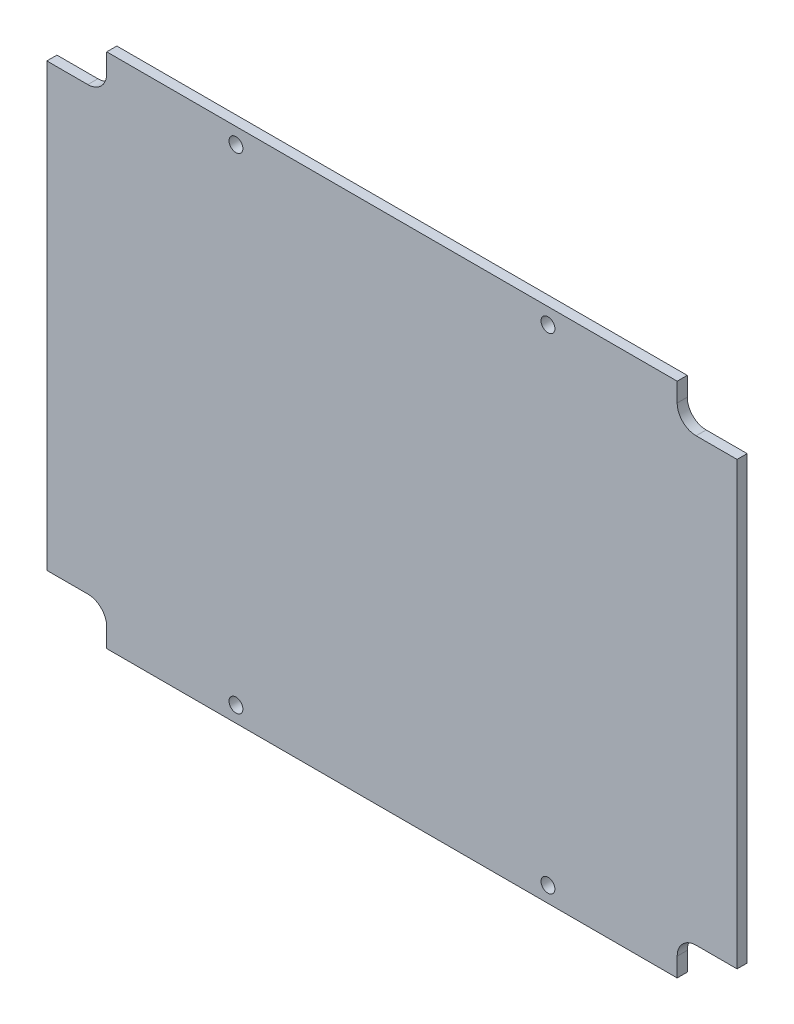
ISO-10303-21;
HEADER;
FILE_DESCRIPTION(('STEP AP214'),'2;1');
FILE_NAME('part.step','',(''),(''),'','','');
FILE_SCHEMA(('AUTOMOTIVE_DESIGN { 1 0 10303 214 1 1 1 1 }'));
ENDSEC;
DATA;
#1=APPLICATION_CONTEXT('core data for automotive mechanical design processes');
#2=APPLICATION_PROTOCOL_DEFINITION('international standard','automotive_design',2000,#1);
#3=PRODUCT_CONTEXT('',#1,'mechanical');
#4=PRODUCT('Part','Part','',(#3));
#5=PRODUCT_RELATED_PRODUCT_CATEGORY('part','',(#4));
#6=PRODUCT_DEFINITION_FORMATION('','',#4);
#7=PRODUCT_DEFINITION_CONTEXT('part definition',#1,'design');
#8=PRODUCT_DEFINITION('design','',#6,#7);
#9=PRODUCT_DEFINITION_SHAPE('','',#8);
#10=(LENGTH_UNIT() NAMED_UNIT(*) SI_UNIT(.MILLI.,.METRE.));
#11=(NAMED_UNIT(*) PLANE_ANGLE_UNIT() SI_UNIT($,.RADIAN.));
#12=(NAMED_UNIT(*) SI_UNIT($,.STERADIAN.) SOLID_ANGLE_UNIT());
#13=UNCERTAINTY_MEASURE_WITH_UNIT(LENGTH_MEASURE(1.E-05),#10,'distance_accuracy_value','');
#14=(GEOMETRIC_REPRESENTATION_CONTEXT(3) GLOBAL_UNCERTAINTY_ASSIGNED_CONTEXT((#13)) GLOBAL_UNIT_ASSIGNED_CONTEXT((#10,
#11,#12)) REPRESENTATION_CONTEXT('',''));
#15=CARTESIAN_POINT('',(0.,0.,0.));
#16=DIRECTION('',(0.,0.,1.));
#17=DIRECTION('',(1.,0.,0.));
#18=AXIS2_PLACEMENT_3D('',#15,#16,#17);
#19=CARTESIAN_POINT('',(54.006358498144,9.95185693007489,1.6));
#20=DIRECTION('',(0.,0.,-1.));
#21=DIRECTION('',(-1.,0.,0.));
#22=AXIS2_PLACEMENT_3D('',#19,#20,#21);
#23=PLANE('',#22);
#24=CARTESIAN_POINT('',(24.006358498144,6.45185693007488,1.6));
#25=DIRECTION('',(0.,0.,1.));
#26=DIRECTION('',(1.,0.,0.));
#27=AXIS2_PLACEMENT_3D('',#24,#25,#26);
#28=CIRCLE('',#27,1.1);
#29=CARTESIAN_POINT('',(25.106358498144,6.45185693007488,1.6));
#30=VERTEX_POINT('',#29);
#31=EDGE_CURVE('E321',#30,#30,#28,.T.);
#32=ORIENTED_EDGE('',*,*,#31,.F.);
#33=EDGE_LOOP('',(#32));
#34=FACE_BOUND('',#33,.T.);
#35=CARTESIAN_POINT('',(-25.493641501856,83.4518569300749,1.6));
#36=DIRECTION('',(0.,0.,1.));
#37=DIRECTION('',(1.,0.,0.));
#38=AXIS2_PLACEMENT_3D('',#35,#36,#37);
#39=CIRCLE('',#38,1.1);
#40=CARTESIAN_POINT('',(-24.393641501856,83.4518569300749,1.6));
#41=VERTEX_POINT('',#40);
#42=EDGE_CURVE('E298',#41,#41,#39,.T.);
#43=ORIENTED_EDGE('',*,*,#42,.F.);
#44=EDGE_LOOP('',(#43));
#45=FACE_BOUND('',#44,.T.);
#46=DIRECTION('',(0.,1.,0.));
#47=VECTOR('',#46,1.);
#48=CARTESIAN_POINT('',(54.006358498144,79.9518569300749,1.6));
#49=LINE('',#48,#47);
#50=CARTESIAN_POINT('',(54.006358498144,9.95185693007489,1.6));
#51=VERTEX_POINT('',#50);
#52=CARTESIAN_POINT('',(54.006358498144,79.9518569300749,1.6));
#53=VERTEX_POINT('',#52);
#54=EDGE_CURVE('E152',#51,#53,#49,.T.);
#55=ORIENTED_EDGE('',*,*,#54,.T.);
#56=DIRECTION('',(-1.,0.,0.));
#57=VECTOR('',#56,1.);
#58=CARTESIAN_POINT('',(54.006358498144,79.9518569300749,1.6));
#59=LINE('',#58,#57);
#60=CARTESIAN_POINT('',(47.506358498144,79.9518569300749,1.6));
#61=VERTEX_POINT('',#60);
#62=EDGE_CURVE('E143',#53,#61,#59,.T.);
#63=ORIENTED_EDGE('',*,*,#62,.T.);
#64=CARTESIAN_POINT('',(47.506358498144,82.9518569300749,1.6));
#65=DIRECTION('',(0.,0.,-1.));
#66=DIRECTION('',(-1.,0.,0.));
#67=AXIS2_PLACEMENT_3D('',#64,#65,#66);
#68=CIRCLE('',#67,3.);
#69=CARTESIAN_POINT('',(44.506358498144,82.9518569300749,1.6));
#70=VERTEX_POINT('',#69);
#71=EDGE_CURVE('E11',#61,#70,#68,.T.);
#72=ORIENTED_EDGE('',*,*,#71,.T.);
#73=DIRECTION('',(0.,1.,0.));
#74=VECTOR('',#73,1.);
#75=CARTESIAN_POINT('',(44.506358498144,79.9518569300749,1.6));
#76=LINE('',#75,#74);
#77=CARTESIAN_POINT('',(44.506358498144,85.9518569300749,1.6));
#78=VERTEX_POINT('',#77);
#79=EDGE_CURVE('E151',#70,#78,#76,.T.);
#80=ORIENTED_EDGE('',*,*,#79,.T.);
#81=DIRECTION('',(-1.,0.,0.));
#82=VECTOR('',#81,1.);
#83=CARTESIAN_POINT('',(-45.993641501856,85.9518569300749,1.6));
#84=LINE('',#83,#82);
#85=CARTESIAN_POINT('',(-45.993641501856,85.9518569300749,1.6));
#86=VERTEX_POINT('',#85);
#87=EDGE_CURVE('E307',#78,#86,#84,.T.);
#88=ORIENTED_EDGE('',*,*,#87,.T.);
#89=DIRECTION('',(0.,-1.,0.));
#90=VECTOR('',#89,1.);
#91=CARTESIAN_POINT('',(-45.993641501856,85.9518569300749,1.6));
#92=LINE('',#91,#90);
#93=CARTESIAN_POINT('',(-45.993641501856,82.9518569300749,1.6));
#94=VERTEX_POINT('',#93);
#95=EDGE_CURVE('E209',#86,#94,#92,.T.);
#96=ORIENTED_EDGE('',*,*,#95,.T.);
#97=CARTESIAN_POINT('',(-48.993641501856,82.9518569300749,1.6));
#98=DIRECTION('',(0.,0.,-1.));
#99=DIRECTION('',(-1.,0.,0.));
#100=AXIS2_PLACEMENT_3D('',#97,#98,#99);
#101=CIRCLE('',#100,3.);
#102=CARTESIAN_POINT('',(-48.993641501856,79.9518569300749,1.6));
#103=VERTEX_POINT('',#102);
#104=EDGE_CURVE('E202',#94,#103,#101,.T.);
#105=ORIENTED_EDGE('',*,*,#104,.T.);
#106=DIRECTION('',(-1.,0.,0.));
#107=VECTOR('',#106,1.);
#108=CARTESIAN_POINT('',(-45.993641501856,79.9518569300749,1.6));
#109=LINE('',#108,#107);
#110=CARTESIAN_POINT('',(-55.493641501856,79.9518569300749,1.6));
#111=VERTEX_POINT('',#110);
#112=EDGE_CURVE('E206',#103,#111,#109,.T.);
#113=ORIENTED_EDGE('',*,*,#112,.T.);
#114=DIRECTION('',(0.,-1.,0.));
#115=VECTOR('',#114,1.);
#116=CARTESIAN_POINT('',(-55.493641501856,79.9518569300749,1.6));
#117=LINE('',#116,#115);
#118=CARTESIAN_POINT('',(-55.493641501856,9.95185693007487,1.6));
#119=VERTEX_POINT('',#118);
#120=EDGE_CURVE('E219',#111,#119,#117,.T.);
#121=ORIENTED_EDGE('',*,*,#120,.T.);
#122=DIRECTION('',(1.,0.,0.));
#123=VECTOR('',#122,1.);
#124=CARTESIAN_POINT('',(-45.993641501856,9.95185693007488,1.6));
#125=LINE('',#124,#123);
#126=CARTESIAN_POINT('',(-48.993641501856,9.95185693007488,1.6));
#127=VERTEX_POINT('',#126);
#128=EDGE_CURVE('E282',#119,#127,#125,.T.);
#129=ORIENTED_EDGE('',*,*,#128,.T.);
#130=CARTESIAN_POINT('',(-48.993641501856,6.95185693007488,1.6));
#131=DIRECTION('',(0.,0.,-1.));
#132=DIRECTION('',(-1.,0.,0.));
#133=AXIS2_PLACEMENT_3D('',#130,#131,#132);
#134=CIRCLE('',#133,3.);
#135=CARTESIAN_POINT('',(-45.993641501856,6.95185693007488,1.6));
#136=VERTEX_POINT('',#135);
#137=EDGE_CURVE('E198',#127,#136,#134,.T.);
#138=ORIENTED_EDGE('',*,*,#137,.T.);
#139=DIRECTION('',(0.,-1.,0.));
#140=VECTOR('',#139,1.);
#141=CARTESIAN_POINT('',(-45.993641501856,3.95185693007488,1.6));
#142=LINE('',#141,#140);
#143=CARTESIAN_POINT('',(-45.993641501856,3.95185693007488,1.6));
#144=VERTEX_POINT('',#143);
#145=EDGE_CURVE('E280',#136,#144,#142,.T.);
#146=ORIENTED_EDGE('',*,*,#145,.T.);
#147=DIRECTION('',(1.,0.,0.));
#148=VECTOR('',#147,1.);
#149=CARTESIAN_POINT('',(-45.993641501856,3.95185693007488,1.6));
#150=LINE('',#149,#148);
#151=CARTESIAN_POINT('',(44.506358498144,3.95185693007488,1.6));
#152=VERTEX_POINT('',#151);
#153=EDGE_CURVE('E286',#144,#152,#150,.T.);
#154=ORIENTED_EDGE('',*,*,#153,.T.);
#155=DIRECTION('',(0.,1.,0.));
#156=VECTOR('',#155,1.);
#157=CARTESIAN_POINT('',(44.506358498144,9.95185693007489,1.6));
#158=LINE('',#157,#156);
#159=CARTESIAN_POINT('',(44.506358498144,6.95185693007489,1.6));
#160=VERTEX_POINT('',#159);
#161=EDGE_CURVE('E288',#152,#160,#158,.T.);
#162=ORIENTED_EDGE('',*,*,#161,.T.);
#163=CARTESIAN_POINT('',(47.506358498144,6.95185693007489,1.6));
#164=DIRECTION('',(0.,0.,-1.));
#165=DIRECTION('',(-1.,0.,0.));
#166=AXIS2_PLACEMENT_3D('',#163,#164,#165);
#167=CIRCLE('',#166,3.);
#168=CARTESIAN_POINT('',(47.506358498144,9.95185693007489,1.6));
#169=VERTEX_POINT('',#168);
#170=EDGE_CURVE('E194',#160,#169,#167,.T.);
#171=ORIENTED_EDGE('',*,*,#170,.T.);
#172=DIRECTION('',(1.,0.,0.));
#173=VECTOR('',#172,1.);
#174=CARTESIAN_POINT('',(54.006358498144,9.95185693007489,1.6));
#175=LINE('',#174,#173);
#176=EDGE_CURVE('E157',#169,#51,#175,.T.);
#177=ORIENTED_EDGE('',*,*,#176,.T.);
#178=EDGE_LOOP('',(#55,#63,#72,#80,#88,#96,#105,#113,#121,#129,#138,#146,#154,#162,#171,#177));
#179=FACE_BOUND('',#178,.T.);
#180=CARTESIAN_POINT('',(24.006358498144,83.4518569300749,1.6));
#181=DIRECTION('',(0.,0.,1.));
#182=DIRECTION('',(1.,0.,0.));
#183=AXIS2_PLACEMENT_3D('',#180,#181,#182);
#184=CIRCLE('',#183,1.1);
#185=CARTESIAN_POINT('',(25.106358498144,83.4518569300749,1.6));
#186=VERTEX_POINT('',#185);
#187=EDGE_CURVE('E315',#186,#186,#184,.T.);
#188=ORIENTED_EDGE('',*,*,#187,.F.);
#189=EDGE_LOOP('',(#188));
#190=FACE_BOUND('',#189,.T.);
#191=CARTESIAN_POINT('',(-25.493641501856,6.45185693007487,1.6));
#192=DIRECTION('',(0.,0.,1.));
#193=DIRECTION('',(1.,0.,0.));
#194=AXIS2_PLACEMENT_3D('',#191,#192,#193);
#195=CIRCLE('',#194,1.1);
#196=CARTESIAN_POINT('',(-24.393641501856,6.45185693007487,1.6));
#197=VERTEX_POINT('',#196);
#198=EDGE_CURVE('E327',#197,#197,#195,.T.);
#199=ORIENTED_EDGE('',*,*,#198,.F.);
#200=EDGE_LOOP('',(#199));
#201=FACE_BOUND('',#200,.T.);
#202=ADVANCED_FACE('F34',(#34,#45,#179,#190,#201),#23,.F.);
#203=CARTESIAN_POINT('',(54.006358498144,9.95185693007489,0.));
#204=DIRECTION('',(0.,0.,-1.));
#205=DIRECTION('',(-1.,0.,0.));
#206=AXIS2_PLACEMENT_3D('',#203,#204,#205);
#207=PLANE('',#206);
#208=CARTESIAN_POINT('',(24.006358498144,6.45185693007488,0.));
#209=DIRECTION('',(0.,0.,1.));
#210=DIRECTION('',(1.,0.,0.));
#211=AXIS2_PLACEMENT_3D('',#208,#209,#210);
#212=CIRCLE('',#211,1.1);
#213=CARTESIAN_POINT('',(25.106358498144,6.45185693007488,0.));
#214=VERTEX_POINT('',#213);
#215=EDGE_CURVE('E324',#214,#214,#212,.T.);
#216=ORIENTED_EDGE('',*,*,#215,.T.);
#217=EDGE_LOOP('',(#216));
#218=FACE_BOUND('',#217,.T.);
#219=CARTESIAN_POINT('',(-25.493641501856,83.4518569300749,0.));
#220=DIRECTION('',(0.,0.,1.));
#221=DIRECTION('',(1.,0.,0.));
#222=AXIS2_PLACEMENT_3D('',#219,#220,#221);
#223=CIRCLE('',#222,1.1);
#224=CARTESIAN_POINT('',(-24.393641501856,83.4518569300749,0.));
#225=VERTEX_POINT('',#224);
#226=EDGE_CURVE('E312',#225,#225,#223,.T.);
#227=ORIENTED_EDGE('',*,*,#226,.T.);
#228=EDGE_LOOP('',(#227));
#229=FACE_BOUND('',#228,.T.);
#230=DIRECTION('',(0.,1.,0.));
#231=VECTOR('',#230,1.);
#232=CARTESIAN_POINT('',(54.006358498144,79.9518569300749,0.));
#233=LINE('',#232,#231);
#234=CARTESIAN_POINT('',(54.006358498144,9.95185693007489,0.));
#235=VERTEX_POINT('',#234);
#236=CARTESIAN_POINT('',(54.006358498144,79.9518569300749,0.));
#237=VERTEX_POINT('',#236);
#238=EDGE_CURVE('E165',#235,#237,#233,.T.);
#239=ORIENTED_EDGE('',*,*,#238,.F.);
#240=DIRECTION('',(1.,0.,0.));
#241=VECTOR('',#240,1.);
#242=CARTESIAN_POINT('',(54.006358498144,9.95185693007489,0.));
#243=LINE('',#242,#241);
#244=CARTESIAN_POINT('',(47.506358498144,9.95185693007489,0.));
#245=VERTEX_POINT('',#244);
#246=EDGE_CURVE('E161',#245,#235,#243,.T.);
#247=ORIENTED_EDGE('',*,*,#246,.F.);
#248=CARTESIAN_POINT('',(47.506358498144,6.95185693007489,0.));
#249=DIRECTION('',(0.,0.,-1.));
#250=DIRECTION('',(-1.,0.,0.));
#251=AXIS2_PLACEMENT_3D('',#248,#249,#250);
#252=CIRCLE('',#251,3.);
#253=CARTESIAN_POINT('',(44.506358498144,6.95185693007489,0.));
#254=VERTEX_POINT('',#253);
#255=EDGE_CURVE('E192',#245,#254,#252,.F.);
#256=ORIENTED_EDGE('',*,*,#255,.T.);
#257=DIRECTION('',(0.,1.,0.));
#258=VECTOR('',#257,1.);
#259=CARTESIAN_POINT('',(44.506358498144,9.95185693007489,0.));
#260=LINE('',#259,#258);
#261=CARTESIAN_POINT('',(44.506358498144,3.95185693007488,0.));
#262=VERTEX_POINT('',#261);
#263=EDGE_CURVE('E250',#262,#254,#260,.T.);
#264=ORIENTED_EDGE('',*,*,#263,.F.);
#265=DIRECTION('',(1.,0.,0.));
#266=VECTOR('',#265,1.);
#267=CARTESIAN_POINT('',(-45.993641501856,3.95185693007488,0.));
#268=LINE('',#267,#266);
#269=CARTESIAN_POINT('',(-45.993641501856,3.95185693007488,0.));
#270=VERTEX_POINT('',#269);
#271=EDGE_CURVE('E248',#270,#262,#268,.T.);
#272=ORIENTED_EDGE('',*,*,#271,.F.);
#273=DIRECTION('',(0.,-1.,0.));
#274=VECTOR('',#273,1.);
#275=CARTESIAN_POINT('',(-45.993641501856,3.95185693007488,0.));
#276=LINE('',#275,#274);
#277=CARTESIAN_POINT('',(-45.993641501856,6.95185693007488,0.));
#278=VERTEX_POINT('',#277);
#279=EDGE_CURVE('E246',#278,#270,#276,.T.);
#280=ORIENTED_EDGE('',*,*,#279,.F.);
#281=CARTESIAN_POINT('',(-48.993641501856,6.95185693007488,0.));
#282=DIRECTION('',(0.,0.,-1.));
#283=DIRECTION('',(-1.,0.,0.));
#284=AXIS2_PLACEMENT_3D('',#281,#282,#283);
#285=CIRCLE('',#284,3.);
#286=CARTESIAN_POINT('',(-48.993641501856,9.95185693007488,0.));
#287=VERTEX_POINT('',#286);
#288=EDGE_CURVE('E196',#278,#287,#285,.F.);
#289=ORIENTED_EDGE('',*,*,#288,.T.);
#290=DIRECTION('',(1.,0.,0.));
#291=VECTOR('',#290,1.);
#292=CARTESIAN_POINT('',(-45.993641501856,9.95185693007488,0.));
#293=LINE('',#292,#291);
#294=CARTESIAN_POINT('',(-55.493641501856,9.95185693007487,0.));
#295=VERTEX_POINT('',#294);
#296=EDGE_CURVE('E243',#295,#287,#293,.T.);
#297=ORIENTED_EDGE('',*,*,#296,.F.);
#298=DIRECTION('',(0.,-1.,0.));
#299=VECTOR('',#298,1.);
#300=CARTESIAN_POINT('',(-55.493641501856,79.9518569300749,0.));
#301=LINE('',#300,#299);
#302=CARTESIAN_POINT('',(-55.493641501856,79.9518569300749,0.));
#303=VERTEX_POINT('',#302);
#304=EDGE_CURVE('E236',#303,#295,#301,.T.);
#305=ORIENTED_EDGE('',*,*,#304,.F.);
#306=DIRECTION('',(-1.,0.,0.));
#307=VECTOR('',#306,1.);
#308=CARTESIAN_POINT('',(-45.993641501856,79.9518569300749,0.));
#309=LINE('',#308,#307);
#310=CARTESIAN_POINT('',(-48.993641501856,79.9518569300749,0.));
#311=VERTEX_POINT('',#310);
#312=EDGE_CURVE('E229',#311,#303,#309,.T.);
#313=ORIENTED_EDGE('',*,*,#312,.F.);
#314=CARTESIAN_POINT('',(-48.993641501856,82.9518569300749,0.));
#315=DIRECTION('',(0.,0.,-1.));
#316=DIRECTION('',(-1.,0.,0.));
#317=AXIS2_PLACEMENT_3D('',#314,#315,#316);
#318=CIRCLE('',#317,3.);
#319=CARTESIAN_POINT('',(-45.993641501856,82.9518569300749,0.));
#320=VERTEX_POINT('',#319);
#321=EDGE_CURVE('E200',#311,#320,#318,.F.);
#322=ORIENTED_EDGE('',*,*,#321,.T.);
#323=DIRECTION('',(0.,-1.,0.));
#324=VECTOR('',#323,1.);
#325=CARTESIAN_POINT('',(-45.993641501856,85.9518569300749,0.));
#326=LINE('',#325,#324);
#327=CARTESIAN_POINT('',(-45.993641501856,85.9518569300749,0.));
#328=VERTEX_POINT('',#327);
#329=EDGE_CURVE('E227',#328,#320,#326,.T.);
#330=ORIENTED_EDGE('',*,*,#329,.F.);
#331=DIRECTION('',(-1.,0.,0.));
#332=VECTOR('',#331,1.);
#333=CARTESIAN_POINT('',(-45.993641501856,85.9518569300749,0.));
#334=LINE('',#333,#332);
#335=CARTESIAN_POINT('',(44.506358498144,85.9518569300749,0.));
#336=VERTEX_POINT('',#335);
#337=EDGE_CURVE('E234',#336,#328,#334,.T.);
#338=ORIENTED_EDGE('',*,*,#337,.F.);
#339=DIRECTION('',(0.,1.,0.));
#340=VECTOR('',#339,1.);
#341=CARTESIAN_POINT('',(44.506358498144,79.9518569300749,0.));
#342=LINE('',#341,#340);
#343=CARTESIAN_POINT('',(44.506358498144,82.9518569300749,0.));
#344=VERTEX_POINT('',#343);
#345=EDGE_CURVE('E238',#344,#336,#342,.T.);
#346=ORIENTED_EDGE('',*,*,#345,.F.);
#347=CARTESIAN_POINT('',(47.506358498144,82.9518569300749,0.));
#348=DIRECTION('',(0.,0.,-1.));
#349=DIRECTION('',(-1.,0.,0.));
#350=AXIS2_PLACEMENT_3D('',#347,#348,#349);
#351=CIRCLE('',#350,3.);
#352=CARTESIAN_POINT('',(47.506358498144,79.9518569300749,0.));
#353=VERTEX_POINT('',#352);
#354=EDGE_CURVE('E42',#344,#353,#351,.F.);
#355=ORIENTED_EDGE('',*,*,#354,.T.);
#356=DIRECTION('',(-1.,0.,0.));
#357=VECTOR('',#356,1.);
#358=CARTESIAN_POINT('',(54.006358498144,79.9518569300749,0.));
#359=LINE('',#358,#357);
#360=EDGE_CURVE('E297',#237,#353,#359,.T.);
#361=ORIENTED_EDGE('',*,*,#360,.F.);
#362=EDGE_LOOP('',(#239,#247,#256,#264,#272,#280,#289,#297,#305,#313,#322,#330,#338,#346,#355,#361));
#363=FACE_BOUND('',#362,.T.);
#364=CARTESIAN_POINT('',(24.006358498144,83.4518569300749,0.));
#365=DIRECTION('',(0.,0.,1.));
#366=DIRECTION('',(1.,0.,0.));
#367=AXIS2_PLACEMENT_3D('',#364,#365,#366);
#368=CIRCLE('',#367,1.1);
#369=CARTESIAN_POINT('',(25.106358498144,83.4518569300749,0.));
#370=VERTEX_POINT('',#369);
#371=EDGE_CURVE('E318',#370,#370,#368,.T.);
#372=ORIENTED_EDGE('',*,*,#371,.T.);
#373=EDGE_LOOP('',(#372));
#374=FACE_BOUND('',#373,.T.);
#375=CARTESIAN_POINT('',(-25.493641501856,6.45185693007487,0.));
#376=DIRECTION('',(0.,0.,1.));
#377=DIRECTION('',(1.,0.,0.));
#378=AXIS2_PLACEMENT_3D('',#375,#376,#377);
#379=CIRCLE('',#378,1.1);
#380=CARTESIAN_POINT('',(-24.393641501856,6.45185693007487,0.));
#381=VERTEX_POINT('',#380);
#382=EDGE_CURVE('E330',#381,#381,#379,.T.);
#383=ORIENTED_EDGE('',*,*,#382,.T.);
#384=EDGE_LOOP('',(#383));
#385=FACE_BOUND('',#384,.T.);
#386=ADVANCED_FACE('F224',(#218,#229,#363,#374,#385),#207,.T.);
#387=CARTESIAN_POINT('',(54.006358498144,79.9518569300749,1.6));
#388=DIRECTION('',(-1.,0.,0.));
#389=DIRECTION('',(0.,-1.,0.));
#390=AXIS2_PLACEMENT_3D('',#387,#388,#389);
#391=PLANE('',#390);
#392=ORIENTED_EDGE('',*,*,#238,.T.);
#393=DIRECTION('',(0.,0.,-1.));
#394=VECTOR('',#393,1.);
#395=CARTESIAN_POINT('',(54.006358498144,79.9518569300749,1.6));
#396=LINE('',#395,#394);
#397=EDGE_CURVE('E147',#53,#237,#396,.T.);
#398=ORIENTED_EDGE('',*,*,#397,.F.);
#399=ORIENTED_EDGE('',*,*,#54,.F.);
#400=DIRECTION('',(0.,0.,-1.));
#401=VECTOR('',#400,1.);
#402=CARTESIAN_POINT('',(54.006358498144,9.95185693007489,1.6));
#403=LINE('',#402,#401);
#404=EDGE_CURVE('E254',#51,#235,#403,.T.);
#405=ORIENTED_EDGE('',*,*,#404,.T.);
#406=EDGE_LOOP('',(#392,#398,#399,#405));
#407=FACE_BOUND('',#406,.T.);
#408=ADVANCED_FACE('F163',(#407),#391,.F.);
#409=CARTESIAN_POINT('',(54.006358498144,79.9518569300749,1.6));
#410=DIRECTION('',(0.,-1.,0.));
#411=DIRECTION('',(0.,0.,-1.));
#412=AXIS2_PLACEMENT_3D('',#409,#410,#411);
#413=PLANE('',#412);
#414=ORIENTED_EDGE('',*,*,#360,.T.);
#415=DIRECTION('',(0.,0.,-1.));
#416=VECTOR('',#415,1.);
#417=CARTESIAN_POINT('',(47.506358498144,79.9518569300749,1.6));
#418=LINE('',#417,#416);
#419=EDGE_CURVE('E49',#353,#61,#418,.F.);
#420=ORIENTED_EDGE('',*,*,#419,.T.);
#421=ORIENTED_EDGE('',*,*,#62,.F.);
#422=ORIENTED_EDGE('',*,*,#397,.T.);
#423=EDGE_LOOP('',(#414,#420,#421,#422));
#424=FACE_BOUND('',#423,.T.);
#425=ADVANCED_FACE('F145',(#424),#413,.F.);
#426=CARTESIAN_POINT('',(44.506358498144,79.9518569300749,1.6));
#427=DIRECTION('',(-1.,0.,0.));
#428=DIRECTION('',(0.,-1.,0.));
#429=AXIS2_PLACEMENT_3D('',#426,#427,#428);
#430=PLANE('',#429);
#431=ORIENTED_EDGE('',*,*,#79,.F.);
#432=DIRECTION('',(0.,0.,-1.));
#433=VECTOR('',#432,1.);
#434=CARTESIAN_POINT('',(44.506358498144,82.9518569300749,0.));
#435=LINE('',#434,#433);
#436=EDGE_CURVE('E188',#70,#344,#435,.T.);
#437=ORIENTED_EDGE('',*,*,#436,.T.);
#438=ORIENTED_EDGE('',*,*,#345,.T.);
#439=DIRECTION('',(0.,0.,-1.));
#440=VECTOR('',#439,1.);
#441=CARTESIAN_POINT('',(44.506358498144,85.9518569300749,1.6));
#442=LINE('',#441,#440);
#443=EDGE_CURVE('E167',#78,#336,#442,.T.);
#444=ORIENTED_EDGE('',*,*,#443,.F.);
#445=EDGE_LOOP('',(#431,#437,#438,#444));
#446=FACE_BOUND('',#445,.T.);
#447=ADVANCED_FACE('F302',(#446),#430,.F.);
#448=CARTESIAN_POINT('',(-45.993641501856,85.9518569300749,1.6));
#449=DIRECTION('',(0.,-1.,0.));
#450=DIRECTION('',(0.,0.,-1.));
#451=AXIS2_PLACEMENT_3D('',#448,#449,#450);
#452=PLANE('',#451);
#453=ORIENTED_EDGE('',*,*,#337,.T.);
#454=DIRECTION('',(0.,0.,-1.));
#455=VECTOR('',#454,1.);
#456=CARTESIAN_POINT('',(-45.993641501856,85.9518569300749,1.6));
#457=LINE('',#456,#455);
#458=EDGE_CURVE('E173',#86,#328,#457,.T.);
#459=ORIENTED_EDGE('',*,*,#458,.F.);
#460=ORIENTED_EDGE('',*,*,#87,.F.);
#461=ORIENTED_EDGE('',*,*,#443,.T.);
#462=EDGE_LOOP('',(#453,#459,#460,#461));
#463=FACE_BOUND('',#462,.T.);
#464=ADVANCED_FACE('F306',(#463),#452,.F.);
#465=CARTESIAN_POINT('',(-45.993641501856,85.9518569300749,1.6));
#466=DIRECTION('',(1.,0.,0.));
#467=DIRECTION('',(0.,1.,0.));
#468=AXIS2_PLACEMENT_3D('',#465,#466,#467);
#469=PLANE('',#468);
#470=ORIENTED_EDGE('',*,*,#329,.T.);
#471=DIRECTION('',(0.,0.,-1.));
#472=VECTOR('',#471,1.);
#473=CARTESIAN_POINT('',(-45.993641501856,82.9518569300749,1.6));
#474=LINE('',#473,#472);
#475=EDGE_CURVE('E186',#320,#94,#474,.F.);
#476=ORIENTED_EDGE('',*,*,#475,.T.);
#477=ORIENTED_EDGE('',*,*,#95,.F.);
#478=ORIENTED_EDGE('',*,*,#458,.T.);
#479=EDGE_LOOP('',(#470,#476,#477,#478));
#480=FACE_BOUND('',#479,.T.);
#481=ADVANCED_FACE('F232',(#480),#469,.F.);
#482=CARTESIAN_POINT('',(-45.993641501856,79.9518569300749,1.6));
#483=DIRECTION('',(0.,-1.,0.));
#484=DIRECTION('',(1.,0.,0.));
#485=AXIS2_PLACEMENT_3D('',#482,#483,#484);
#486=PLANE('',#485);
#487=ORIENTED_EDGE('',*,*,#112,.F.);
#488=DIRECTION('',(0.,0.,-1.));
#489=VECTOR('',#488,1.);
#490=CARTESIAN_POINT('',(-48.993641501856,79.9518569300749,0.));
#491=LINE('',#490,#489);
#492=EDGE_CURVE('E183',#103,#311,#491,.T.);
#493=ORIENTED_EDGE('',*,*,#492,.T.);
#494=ORIENTED_EDGE('',*,*,#312,.T.);
#495=DIRECTION('',(0.,0.,-1.));
#496=VECTOR('',#495,1.);
#497=CARTESIAN_POINT('',(-55.493641501856,79.9518569300749,1.6));
#498=LINE('',#497,#496);
#499=EDGE_CURVE('E217',#111,#303,#498,.T.);
#500=ORIENTED_EDGE('',*,*,#499,.F.);
#501=EDGE_LOOP('',(#487,#493,#494,#500));
#502=FACE_BOUND('',#501,.T.);
#503=ADVANCED_FACE('F214',(#502),#486,.F.);
#504=CARTESIAN_POINT('',(-55.493641501856,79.9518569300749,1.6));
#505=DIRECTION('',(1.,0.,0.));
#506=DIRECTION('',(0.,0.,-1.));
#507=AXIS2_PLACEMENT_3D('',#504,#505,#506);
#508=PLANE('',#507);
#509=ORIENTED_EDGE('',*,*,#304,.T.);
#510=DIRECTION('',(0.,0.,-1.));
#511=VECTOR('',#510,1.);
#512=CARTESIAN_POINT('',(-55.493641501856,9.95185693007487,1.6));
#513=LINE('',#512,#511);
#514=EDGE_CURVE('E262',#119,#295,#513,.T.);
#515=ORIENTED_EDGE('',*,*,#514,.F.);
#516=ORIENTED_EDGE('',*,*,#120,.F.);
#517=ORIENTED_EDGE('',*,*,#499,.T.);
#518=EDGE_LOOP('',(#509,#515,#516,#517));
#519=FACE_BOUND('',#518,.T.);
#520=ADVANCED_FACE('F266',(#519),#508,.F.);
#521=CARTESIAN_POINT('',(-45.993641501856,9.95185693007488,1.6));
#522=DIRECTION('',(0.,1.,0.));
#523=DIRECTION('',(-1.,0.,0.));
#524=AXIS2_PLACEMENT_3D('',#521,#522,#523);
#525=PLANE('',#524);
#526=ORIENTED_EDGE('',*,*,#296,.T.);
#527=DIRECTION('',(0.,0.,-1.));
#528=VECTOR('',#527,1.);
#529=CARTESIAN_POINT('',(-48.993641501856,9.95185693007488,1.6));
#530=LINE('',#529,#528);
#531=EDGE_CURVE('E181',#287,#127,#530,.F.);
#532=ORIENTED_EDGE('',*,*,#531,.T.);
#533=ORIENTED_EDGE('',*,*,#128,.F.);
#534=ORIENTED_EDGE('',*,*,#514,.T.);
#535=EDGE_LOOP('',(#526,#532,#533,#534));
#536=FACE_BOUND('',#535,.T.);
#537=ADVANCED_FACE('F272',(#536),#525,.F.);
#538=CARTESIAN_POINT('',(-45.993641501856,3.95185693007488,1.6));
#539=DIRECTION('',(1.,0.,0.));
#540=DIRECTION('',(0.,0.,-1.));
#541=AXIS2_PLACEMENT_3D('',#538,#539,#540);
#542=PLANE('',#541);
#543=ORIENTED_EDGE('',*,*,#145,.F.);
#544=DIRECTION('',(0.,0.,-1.));
#545=VECTOR('',#544,1.);
#546=CARTESIAN_POINT('',(-45.993641501856,6.95185693007488,0.));
#547=LINE('',#546,#545);
#548=EDGE_CURVE('E178',#136,#278,#547,.T.);
#549=ORIENTED_EDGE('',*,*,#548,.T.);
#550=ORIENTED_EDGE('',*,*,#279,.T.);
#551=DIRECTION('',(0.,0.,-1.));
#552=VECTOR('',#551,1.);
#553=CARTESIAN_POINT('',(-45.993641501856,3.95185693007488,1.6));
#554=LINE('',#553,#552);
#555=EDGE_CURVE('E259',#144,#270,#554,.T.);
#556=ORIENTED_EDGE('',*,*,#555,.F.);
#557=EDGE_LOOP('',(#543,#549,#550,#556));
#558=FACE_BOUND('',#557,.T.);
#559=ADVANCED_FACE('F284',(#558),#542,.F.);
#560=CARTESIAN_POINT('',(-45.993641501856,3.95185693007488,1.6));
#561=DIRECTION('',(0.,1.,0.));
#562=DIRECTION('',(0.,0.,1.));
#563=AXIS2_PLACEMENT_3D('',#560,#561,#562);
#564=PLANE('',#563);
#565=ORIENTED_EDGE('',*,*,#271,.T.);
#566=DIRECTION('',(0.,0.,-1.));
#567=VECTOR('',#566,1.);
#568=CARTESIAN_POINT('',(44.506358498144,3.95185693007488,1.6));
#569=LINE('',#568,#567);
#570=EDGE_CURVE('E256',#152,#262,#569,.T.);
#571=ORIENTED_EDGE('',*,*,#570,.F.);
#572=ORIENTED_EDGE('',*,*,#153,.F.);
#573=ORIENTED_EDGE('',*,*,#555,.T.);
#574=EDGE_LOOP('',(#565,#571,#572,#573));
#575=FACE_BOUND('',#574,.T.);
#576=ADVANCED_FACE('F360',(#575),#564,.F.);
#577=CARTESIAN_POINT('',(44.506358498144,9.95185693007489,1.6));
#578=DIRECTION('',(-1.,0.,0.));
#579=DIRECTION('',(0.,-1.,0.));
#580=AXIS2_PLACEMENT_3D('',#577,#578,#579);
#581=PLANE('',#580);
#582=ORIENTED_EDGE('',*,*,#263,.T.);
#583=DIRECTION('',(0.,0.,-1.));
#584=VECTOR('',#583,1.);
#585=CARTESIAN_POINT('',(44.506358498144,6.95185693007489,1.6));
#586=LINE('',#585,#584);
#587=EDGE_CURVE('E170',#254,#160,#586,.F.);
#588=ORIENTED_EDGE('',*,*,#587,.T.);
#589=ORIENTED_EDGE('',*,*,#161,.F.);
#590=ORIENTED_EDGE('',*,*,#570,.T.);
#591=EDGE_LOOP('',(#582,#588,#589,#590));
#592=FACE_BOUND('',#591,.T.);
#593=ADVANCED_FACE('F356',(#592),#581,.F.);
#594=CARTESIAN_POINT('',(54.006358498144,9.95185693007489,1.6));
#595=DIRECTION('',(0.,1.,0.));
#596=DIRECTION('',(-1.,0.,0.));
#597=AXIS2_PLACEMENT_3D('',#594,#595,#596);
#598=PLANE('',#597);
#599=ORIENTED_EDGE('',*,*,#176,.F.);
#600=DIRECTION('',(0.,0.,-1.));
#601=VECTOR('',#600,1.);
#602=CARTESIAN_POINT('',(47.506358498144,9.95185693007489,0.));
#603=LINE('',#602,#601);
#604=EDGE_CURVE('E166',#169,#245,#603,.T.);
#605=ORIENTED_EDGE('',*,*,#604,.T.);
#606=ORIENTED_EDGE('',*,*,#246,.T.);
#607=ORIENTED_EDGE('',*,*,#404,.F.);
#608=EDGE_LOOP('',(#599,#605,#606,#607));
#609=FACE_BOUND('',#608,.T.);
#610=ADVANCED_FACE('F353',(#609),#598,.F.);
#611=CARTESIAN_POINT('',(-25.493641501856,83.4518569300749,1.6));
#612=DIRECTION('',(0.,0.,-1.));
#613=DIRECTION('',(-1.,0.,0.));
#614=AXIS2_PLACEMENT_3D('',#611,#612,#613);
#615=CYLINDRICAL_SURFACE('',#614,1.1);
#616=ORIENTED_EDGE('',*,*,#42,.T.);
#617=EDGE_LOOP('',(#616));
#618=FACE_BOUND('',#617,.T.);
#619=ORIENTED_EDGE('',*,*,#226,.F.);
#620=EDGE_LOOP('',(#619));
#621=FACE_BOUND('',#620,.T.);
#622=ADVANCED_FACE('F350',(#618,#621),#615,.F.);
#623=CARTESIAN_POINT('',(24.006358498144,83.4518569300749,1.6));
#624=DIRECTION('',(0.,0.,-1.));
#625=DIRECTION('',(-1.,0.,0.));
#626=AXIS2_PLACEMENT_3D('',#623,#624,#625);
#627=CYLINDRICAL_SURFACE('',#626,1.1);
#628=ORIENTED_EDGE('',*,*,#187,.T.);
#629=EDGE_LOOP('',(#628));
#630=FACE_BOUND('',#629,.T.);
#631=ORIENTED_EDGE('',*,*,#371,.F.);
#632=EDGE_LOOP('',(#631));
#633=FACE_BOUND('',#632,.T.);
#634=ADVANCED_FACE('F495',(#630,#633),#627,.F.);
#635=CARTESIAN_POINT('',(24.006358498144,6.45185693007488,1.6));
#636=DIRECTION('',(0.,0.,-1.));
#637=DIRECTION('',(-1.,0.,0.));
#638=AXIS2_PLACEMENT_3D('',#635,#636,#637);
#639=CYLINDRICAL_SURFACE('',#638,1.1);
#640=ORIENTED_EDGE('',*,*,#31,.T.);
#641=EDGE_LOOP('',(#640));
#642=FACE_BOUND('',#641,.T.);
#643=ORIENTED_EDGE('',*,*,#215,.F.);
#644=EDGE_LOOP('',(#643));
#645=FACE_BOUND('',#644,.T.);
#646=ADVANCED_FACE('F486',(#642,#645),#639,.F.);
#647=CARTESIAN_POINT('',(-25.493641501856,6.45185693007487,1.6));
#648=DIRECTION('',(0.,0.,-1.));
#649=DIRECTION('',(-1.,0.,0.));
#650=AXIS2_PLACEMENT_3D('',#647,#648,#649);
#651=CYLINDRICAL_SURFACE('',#650,1.1);
#652=ORIENTED_EDGE('',*,*,#198,.T.);
#653=EDGE_LOOP('',(#652));
#654=FACE_BOUND('',#653,.T.);
#655=ORIENTED_EDGE('',*,*,#382,.F.);
#656=EDGE_LOOP('',(#655));
#657=FACE_BOUND('',#656,.T.);
#658=ADVANCED_FACE('F336',(#654,#657),#651,.F.);
#659=CARTESIAN_POINT('',(47.506358498144,6.95185693007489,1.6));
#660=DIRECTION('',(0.,0.,1.));
#661=DIRECTION('',(1.,0.,0.));
#662=AXIS2_PLACEMENT_3D('',#659,#660,#661);
#663=CYLINDRICAL_SURFACE('',#662,3.);
#664=ORIENTED_EDGE('',*,*,#170,.F.);
#665=ORIENTED_EDGE('',*,*,#587,.F.);
#666=ORIENTED_EDGE('',*,*,#255,.F.);
#667=ORIENTED_EDGE('',*,*,#604,.F.);
#668=EDGE_LOOP('',(#664,#665,#666,#667));
#669=FACE_BOUND('',#668,.T.);
#670=ADVANCED_FACE('F383',(#669),#663,.F.);
#671=CARTESIAN_POINT('',(-48.993641501856,6.95185693007488,1.6));
#672=DIRECTION('',(0.,0.,1.));
#673=DIRECTION('',(1.,0.,0.));
#674=AXIS2_PLACEMENT_3D('',#671,#672,#673);
#675=CYLINDRICAL_SURFACE('',#674,3.);
#676=ORIENTED_EDGE('',*,*,#137,.F.);
#677=ORIENTED_EDGE('',*,*,#531,.F.);
#678=ORIENTED_EDGE('',*,*,#288,.F.);
#679=ORIENTED_EDGE('',*,*,#548,.F.);
#680=EDGE_LOOP('',(#676,#677,#678,#679));
#681=FACE_BOUND('',#680,.T.);
#682=ADVANCED_FACE('F277',(#681),#675,.F.);
#683=CARTESIAN_POINT('',(-48.993641501856,82.9518569300749,1.6));
#684=DIRECTION('',(0.,0.,1.));
#685=DIRECTION('',(1.,0.,0.));
#686=AXIS2_PLACEMENT_3D('',#683,#684,#685);
#687=CYLINDRICAL_SURFACE('',#686,3.);
#688=ORIENTED_EDGE('',*,*,#104,.F.);
#689=ORIENTED_EDGE('',*,*,#475,.F.);
#690=ORIENTED_EDGE('',*,*,#321,.F.);
#691=ORIENTED_EDGE('',*,*,#492,.F.);
#692=EDGE_LOOP('',(#688,#689,#690,#691));
#693=FACE_BOUND('',#692,.T.);
#694=ADVANCED_FACE('F221',(#693),#687,.F.);
#695=CARTESIAN_POINT('',(47.506358498144,82.9518569300749,1.6));
#696=DIRECTION('',(0.,0.,1.));
#697=DIRECTION('',(1.,0.,0.));
#698=AXIS2_PLACEMENT_3D('',#695,#696,#697);
#699=CYLINDRICAL_SURFACE('',#698,3.);
#700=ORIENTED_EDGE('',*,*,#71,.F.);
#701=ORIENTED_EDGE('',*,*,#419,.F.);
#702=ORIENTED_EDGE('',*,*,#354,.F.);
#703=ORIENTED_EDGE('',*,*,#436,.F.);
#704=EDGE_LOOP('',(#700,#701,#702,#703));
#705=FACE_BOUND('',#704,.T.);
#706=ADVANCED_FACE('F36',(#705),#699,.F.);
#707=CLOSED_SHELL('',(#202,#386,#408,#425,#447,#464,#481,#503,#520,#537,#559,#576,#593,#610,
#622,#634,#646,#658,#670,#682,#694,#706));
#708=MANIFOLD_SOLID_BREP('B2',#707);
#709=ADVANCED_BREP_SHAPE_REPRESENTATION('',(#18,#708),#14);
#710=SHAPE_DEFINITION_REPRESENTATION(#9,#709);
ENDSEC;
END-ISO-10303-21;
